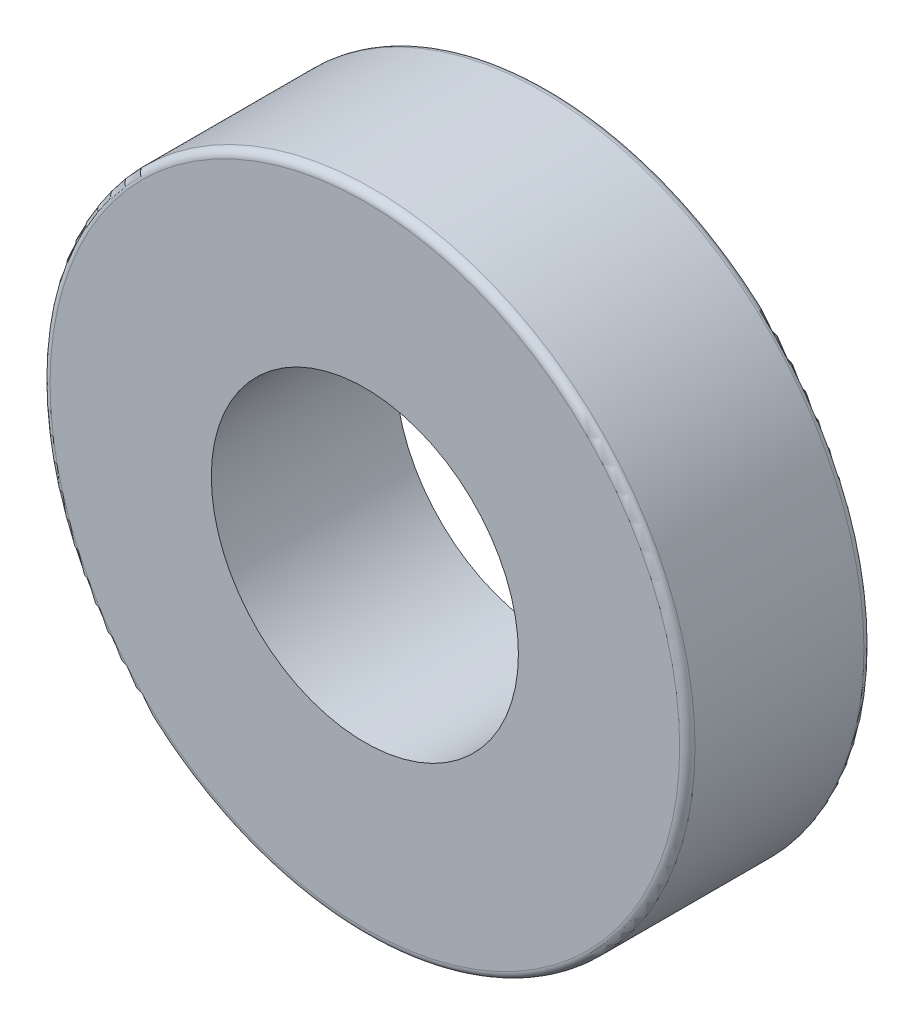
ISO-10303-21;
HEADER;
FILE_DESCRIPTION(('STEP AP214'),'2;1');
FILE_NAME('part.step','',(''),(''),'','','');
FILE_SCHEMA(('AUTOMOTIVE_DESIGN { 1 0 10303 214 1 1 1 1 }'));
ENDSEC;
DATA;
#1=APPLICATION_CONTEXT('core data for automotive mechanical design processes');
#2=APPLICATION_PROTOCOL_DEFINITION('international standard','automotive_design',2000,#1);
#3=PRODUCT_CONTEXT('',#1,'mechanical');
#4=PRODUCT('Part','Part','',(#3));
#5=PRODUCT_RELATED_PRODUCT_CATEGORY('part','',(#4));
#6=PRODUCT_DEFINITION_FORMATION('','',#4);
#7=PRODUCT_DEFINITION_CONTEXT('part definition',#1,'design');
#8=PRODUCT_DEFINITION('design','',#6,#7);
#9=PRODUCT_DEFINITION_SHAPE('','',#8);
#10=(LENGTH_UNIT() NAMED_UNIT(*) SI_UNIT(.MILLI.,.METRE.));
#11=(NAMED_UNIT(*) PLANE_ANGLE_UNIT() SI_UNIT($,.RADIAN.));
#12=(NAMED_UNIT(*) SI_UNIT($,.STERADIAN.) SOLID_ANGLE_UNIT());
#13=UNCERTAINTY_MEASURE_WITH_UNIT(LENGTH_MEASURE(1.E-05),#10,'distance_accuracy_value','');
#14=(GEOMETRIC_REPRESENTATION_CONTEXT(3) GLOBAL_UNCERTAINTY_ASSIGNED_CONTEXT((#13)) GLOBAL_UNIT_ASSIGNED_CONTEXT((#10,
#11,#12)) REPRESENTATION_CONTEXT('',''));
#15=CARTESIAN_POINT('',(0.,0.,0.));
#16=DIRECTION('',(0.,0.,1.));
#17=DIRECTION('',(1.,0.,0.));
#18=AXIS2_PLACEMENT_3D('',#15,#16,#17);
#19=CARTESIAN_POINT('',(0.,0.,12.));
#20=DIRECTION('',(0.,0.,1.));
#21=DIRECTION('',(1.,0.,0.));
#22=AXIS2_PLACEMENT_3D('',#19,#20,#21);
#23=PLANE('',#22);
#24=CARTESIAN_POINT('',(0.,0.,12.));
#25=DIRECTION('',(0.,0.,1.));
#26=DIRECTION('',(1.,0.,0.));
#27=AXIS2_PLACEMENT_3D('',#24,#25,#26);
#28=CIRCLE('',#27,20.5);
#29=CARTESIAN_POINT('',(20.5,0.,12.));
#30=VERTEX_POINT('',#29);
#31=EDGE_CURVE('E10',#30,#30,#28,.T.);
#32=ORIENTED_EDGE('',*,*,#31,.T.);
#33=EDGE_LOOP('',(#32));
#34=FACE_BOUND('',#33,.T.);
#35=CARTESIAN_POINT('',(0.,0.,12.));
#36=DIRECTION('',(0.,0.,1.));
#37=DIRECTION('',(1.,0.,0.));
#38=AXIS2_PLACEMENT_3D('',#35,#36,#37);
#39=CIRCLE('',#38,10.);
#40=CARTESIAN_POINT('',(10.,0.,12.));
#41=VERTEX_POINT('',#40);
#42=EDGE_CURVE('E62',#41,#41,#39,.T.);
#43=ORIENTED_EDGE('',*,*,#42,.F.);
#44=EDGE_LOOP('',(#43));
#45=FACE_BOUND('',#44,.T.);
#46=ADVANCED_FACE('F41',(#34,#45),#23,.T.);
#47=CARTESIAN_POINT('',(0.,0.,0.));
#48=DIRECTION('',(0.,0.,1.));
#49=DIRECTION('',(1.,0.,0.));
#50=AXIS2_PLACEMENT_3D('',#47,#48,#49);
#51=PLANE('',#50);
#52=CARTESIAN_POINT('',(0.,0.,0.));
#53=DIRECTION('',(0.,0.,1.));
#54=DIRECTION('',(1.,0.,0.));
#55=AXIS2_PLACEMENT_3D('',#52,#53,#54);
#56=CIRCLE('',#55,20.5);
#57=CARTESIAN_POINT('',(20.5,0.,0.));
#58=VERTEX_POINT('',#57);
#59=EDGE_CURVE('E48',#58,#58,#56,.F.);
#60=ORIENTED_EDGE('',*,*,#59,.T.);
#61=EDGE_LOOP('',(#60));
#62=FACE_BOUND('',#61,.T.);
#63=CARTESIAN_POINT('',(0.,0.,0.));
#64=DIRECTION('',(0.,0.,1.));
#65=DIRECTION('',(1.,0.,0.));
#66=AXIS2_PLACEMENT_3D('',#63,#64,#65);
#67=CIRCLE('',#66,10.);
#68=CARTESIAN_POINT('',(10.,0.,0.));
#69=VERTEX_POINT('',#68);
#70=EDGE_CURVE('E65',#69,#69,#67,.T.);
#71=ORIENTED_EDGE('',*,*,#70,.T.);
#72=EDGE_LOOP('',(#71));
#73=FACE_BOUND('',#72,.T.);
#74=ADVANCED_FACE('F75',(#62,#73),#51,.F.);
#75=CARTESIAN_POINT('',(0.,0.,12.));
#76=DIRECTION('',(0.,0.,-1.));
#77=DIRECTION('',(-1.,0.,0.));
#78=AXIS2_PLACEMENT_3D('',#75,#76,#77);
#79=CYLINDRICAL_SURFACE('',#78,21.);
#80=CARTESIAN_POINT('',(0.,0.,0.5));
#81=DIRECTION('',(0.,0.,1.));
#82=DIRECTION('',(1.,0.,0.));
#83=AXIS2_PLACEMENT_3D('',#80,#81,#82);
#84=CIRCLE('',#83,21.);
#85=CARTESIAN_POINT('',(21.,0.,0.5));
#86=VERTEX_POINT('',#85);
#87=EDGE_CURVE('E55',#86,#86,#84,.T.);
#88=ORIENTED_EDGE('',*,*,#87,.T.);
#89=EDGE_LOOP('',(#88));
#90=FACE_BOUND('',#89,.T.);
#91=CARTESIAN_POINT('',(0.,0.,11.5));
#92=DIRECTION('',(0.,0.,1.));
#93=DIRECTION('',(1.,0.,0.));
#94=AXIS2_PLACEMENT_3D('',#91,#92,#93);
#95=CIRCLE('',#94,21.);
#96=CARTESIAN_POINT('',(21.,0.,11.5));
#97=VERTEX_POINT('',#96);
#98=EDGE_CURVE('E57',#97,#97,#95,.F.);
#99=ORIENTED_EDGE('',*,*,#98,.T.);
#100=EDGE_LOOP('',(#99));
#101=FACE_BOUND('',#100,.T.);
#102=ADVANCED_FACE('F79',(#90,#101),#79,.T.);
#103=CARTESIAN_POINT('',(0.,0.,12.));
#104=DIRECTION('',(0.,0.,-1.));
#105=DIRECTION('',(-1.,0.,0.));
#106=AXIS2_PLACEMENT_3D('',#103,#104,#105);
#107=CYLINDRICAL_SURFACE('',#106,10.);
#108=ORIENTED_EDGE('',*,*,#42,.T.);
#109=EDGE_LOOP('',(#108));
#110=FACE_BOUND('',#109,.T.);
#111=ORIENTED_EDGE('',*,*,#70,.F.);
#112=EDGE_LOOP('',(#111));
#113=FACE_BOUND('',#112,.T.);
#114=ADVANCED_FACE('F69',(#110,#113),#107,.F.);
#115=CARTESIAN_POINT('',(0.,0.,0.5));
#116=DIRECTION('',(0.,0.,1.));
#117=DIRECTION('',(1.,0.,0.));
#118=AXIS2_PLACEMENT_3D('',#115,#116,#117);
#119=TOROIDAL_SURFACE('',#118,20.5,0.5);
#120=ORIENTED_EDGE('',*,*,#59,.F.);
#121=EDGE_LOOP('',(#120));
#122=FACE_BOUND('',#121,.T.);
#123=ORIENTED_EDGE('',*,*,#87,.F.);
#124=EDGE_LOOP('',(#123));
#125=FACE_BOUND('',#124,.T.);
#126=ADVANCED_FACE('F83',(#122,#125),#119,.T.);
#127=CARTESIAN_POINT('',(0.,0.,11.5));
#128=DIRECTION('',(0.,0.,1.));
#129=DIRECTION('',(1.,0.,0.));
#130=AXIS2_PLACEMENT_3D('',#127,#128,#129);
#131=TOROIDAL_SURFACE('',#130,20.5,0.5);
#132=ORIENTED_EDGE('',*,*,#98,.F.);
#133=EDGE_LOOP('',(#132));
#134=FACE_BOUND('',#133,.T.);
#135=ORIENTED_EDGE('',*,*,#31,.F.);
#136=EDGE_LOOP('',(#135));
#137=FACE_BOUND('',#136,.T.);
#138=ADVANCED_FACE('F43',(#134,#137),#131,.T.);
#139=CLOSED_SHELL('',(#46,#74,#102,#114,#126,#138));
#140=MANIFOLD_SOLID_BREP('B2',#139);
#141=ADVANCED_BREP_SHAPE_REPRESENTATION('',(#18,#140),#14);
#142=SHAPE_DEFINITION_REPRESENTATION(#9,#141);
ENDSEC;
END-ISO-10303-21;
